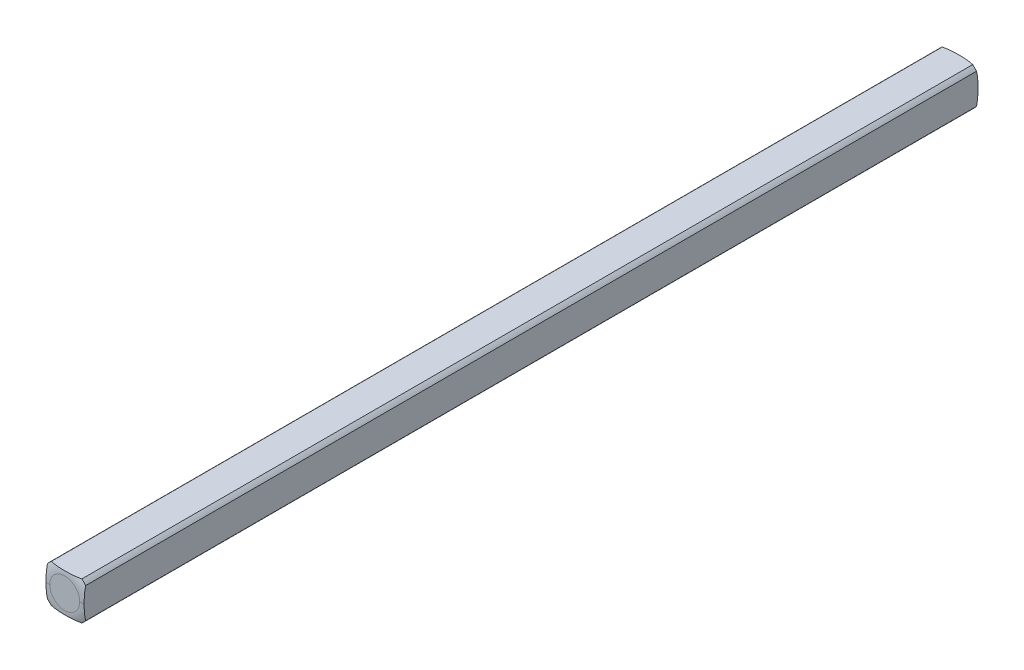
ISO-10303-21;
HEADER;
FILE_DESCRIPTION(('STEP AP214'),'2;1');
FILE_NAME('part.step','',(''),(''),'','','');
FILE_SCHEMA(('AUTOMOTIVE_DESIGN { 1 0 10303 214 1 1 1 1 }'));
ENDSEC;
DATA;
#1=APPLICATION_CONTEXT('core data for automotive mechanical design processes');
#2=APPLICATION_PROTOCOL_DEFINITION('international standard','automotive_design',2000,#1);
#3=PRODUCT_CONTEXT('',#1,'mechanical');
#4=PRODUCT('Part','Part','',(#3));
#5=PRODUCT_RELATED_PRODUCT_CATEGORY('part','',(#4));
#6=PRODUCT_DEFINITION_FORMATION('','',#4);
#7=PRODUCT_DEFINITION_CONTEXT('part definition',#1,'design');
#8=PRODUCT_DEFINITION('design','',#6,#7);
#9=PRODUCT_DEFINITION_SHAPE('','',#8);
#10=(LENGTH_UNIT() NAMED_UNIT(*) SI_UNIT(.MILLI.,.METRE.));
#11=(NAMED_UNIT(*) PLANE_ANGLE_UNIT() SI_UNIT($,.RADIAN.));
#12=(NAMED_UNIT(*) SI_UNIT($,.STERADIAN.) SOLID_ANGLE_UNIT());
#13=UNCERTAINTY_MEASURE_WITH_UNIT(LENGTH_MEASURE(1.E-05),#10,'distance_accuracy_value','');
#14=(GEOMETRIC_REPRESENTATION_CONTEXT(3) GLOBAL_UNCERTAINTY_ASSIGNED_CONTEXT((#13)) GLOBAL_UNIT_ASSIGNED_CONTEXT((#10,
#11,#12)) REPRESENTATION_CONTEXT('',''));
#15=CARTESIAN_POINT('',(0.,0.,0.));
#16=DIRECTION('',(0.,0.,1.));
#17=DIRECTION('',(1.,0.,0.));
#18=AXIS2_PLACEMENT_3D('',#15,#16,#17);
#19=CARTESIAN_POINT('',(0.,0.,-37.211));
#20=DIRECTION('',(0.,0.,1.));
#21=DIRECTION('',(1.,0.,0.));
#22=AXIS2_PLACEMENT_3D('',#19,#20,#21);
#23=CYLINDRICAL_SURFACE('',#22,2.032);
#24=CARTESIAN_POINT('',(0.,0.,-37.059919142098));
#25=DIRECTION('',(0.,0.,1.));
#26=DIRECTION('',(1.,0.,0.));
#27=AXIS2_PLACEMENT_3D('',#24,#25,#26);
#28=CIRCLE('',#27,2.032);
#29=CARTESIAN_POINT('',(-1.26841150657032,1.5875,-37.059919142098));
#30=VERTEX_POINT('',#29);
#31=CARTESIAN_POINT('',(-1.5875,1.26841150657032,-37.059919142098));
#32=VERTEX_POINT('',#31);
#33=EDGE_CURVE('E394',#30,#32,#28,.T.);
#34=ORIENTED_EDGE('',*,*,#33,.T.);
#35=DIRECTION('',(0.,0.,1.));
#36=VECTOR('',#35,1.);
#37=CARTESIAN_POINT('',(-1.5875,1.26841150657032,-37.211));
#38=LINE('',#37,#36);
#39=CARTESIAN_POINT('',(-1.5875,1.26841150657032,37.059919142098));
#40=VERTEX_POINT('',#39);
#41=EDGE_CURVE('E255',#32,#40,#38,.T.);
#42=ORIENTED_EDGE('',*,*,#41,.T.);
#43=CARTESIAN_POINT('',(0.,0.,37.059919142098));
#44=DIRECTION('',(0.,0.,-1.));
#45=DIRECTION('',(-1.,0.,0.));
#46=AXIS2_PLACEMENT_3D('',#43,#44,#45);
#47=CIRCLE('',#46,2.032);
#48=CARTESIAN_POINT('',(-1.26841150657032,1.5875,37.059919142098));
#49=VERTEX_POINT('',#48);
#50=EDGE_CURVE('E9',#40,#49,#47,.T.);
#51=ORIENTED_EDGE('',*,*,#50,.T.);
#52=DIRECTION('',(0.,0.,-1.));
#53=VECTOR('',#52,1.);
#54=CARTESIAN_POINT('',(-1.26841150657032,1.5875,-37.211));
#55=LINE('',#54,#53);
#56=EDGE_CURVE('E501',#49,#30,#55,.T.);
#57=ORIENTED_EDGE('',*,*,#56,.T.);
#58=EDGE_LOOP('',(#34,#42,#51,#57));
#59=FACE_BOUND('',#58,.T.);
#60=ADVANCED_FACE('F15',(#59),#23,.T.);
#61=CARTESIAN_POINT('',(0.,0.,-37.211));
#62=DIRECTION('',(0.,0.,1.));
#63=DIRECTION('',(1.,0.,0.));
#64=AXIS2_PLACEMENT_3D('',#61,#62,#63);
#65=CYLINDRICAL_SURFACE('',#64,2.032);
#66=CARTESIAN_POINT('',(0.,0.,-37.059919142098));
#67=DIRECTION('',(0.,0.,1.));
#68=DIRECTION('',(1.,0.,0.));
#69=AXIS2_PLACEMENT_3D('',#66,#67,#68);
#70=CIRCLE('',#69,2.032);
#71=CARTESIAN_POINT('',(1.5875,1.26841150657032,-37.059919142098));
#72=VERTEX_POINT('',#71);
#73=CARTESIAN_POINT('',(1.26841150657032,1.5875,-37.059919142098));
#74=VERTEX_POINT('',#73);
#75=EDGE_CURVE('E164',#72,#74,#70,.T.);
#76=ORIENTED_EDGE('',*,*,#75,.T.);
#77=DIRECTION('',(0.,0.,1.));
#78=VECTOR('',#77,1.);
#79=CARTESIAN_POINT('',(1.26841150657032,1.5875,-37.211));
#80=LINE('',#79,#78);
#81=CARTESIAN_POINT('',(1.26841150657032,1.5875,37.059919142098));
#82=VERTEX_POINT('',#81);
#83=EDGE_CURVE('E66',#74,#82,#80,.T.);
#84=ORIENTED_EDGE('',*,*,#83,.T.);
#85=CARTESIAN_POINT('',(0.,0.,37.059919142098));
#86=DIRECTION('',(0.,0.,-1.));
#87=DIRECTION('',(-1.,0.,0.));
#88=AXIS2_PLACEMENT_3D('',#85,#86,#87);
#89=CIRCLE('',#88,2.032);
#90=CARTESIAN_POINT('',(1.5875,1.26841150657032,37.059919142098));
#91=VERTEX_POINT('',#90);
#92=EDGE_CURVE('E29',#82,#91,#89,.T.);
#93=ORIENTED_EDGE('',*,*,#92,.T.);
#94=DIRECTION('',(0.,0.,-1.));
#95=VECTOR('',#94,1.);
#96=CARTESIAN_POINT('',(1.5875,1.26841150657032,-37.211));
#97=LINE('',#96,#95);
#98=EDGE_CURVE('E67',#91,#72,#97,.T.);
#99=ORIENTED_EDGE('',*,*,#98,.T.);
#100=EDGE_LOOP('',(#76,#84,#93,#99));
#101=FACE_BOUND('',#100,.T.);
#102=ADVANCED_FACE('F17',(#101),#65,.T.);
#103=CARTESIAN_POINT('',(0.,0.,-37.211));
#104=DIRECTION('',(0.,0.,1.));
#105=DIRECTION('',(1.,0.,0.));
#106=AXIS2_PLACEMENT_3D('',#103,#104,#105);
#107=CYLINDRICAL_SURFACE('',#106,2.032);
#108=CARTESIAN_POINT('',(0.,0.,-37.059919142098));
#109=DIRECTION('',(0.,0.,1.));
#110=DIRECTION('',(1.,0.,0.));
#111=AXIS2_PLACEMENT_3D('',#108,#109,#110);
#112=CIRCLE('',#111,2.032);
#113=CARTESIAN_POINT('',(1.26841150657032,-1.5875,-37.059919142098));
#114=VERTEX_POINT('',#113);
#115=CARTESIAN_POINT('',(1.5875,-1.26841150657032,-37.059919142098));
#116=VERTEX_POINT('',#115);
#117=EDGE_CURVE('E441',#114,#116,#112,.T.);
#118=ORIENTED_EDGE('',*,*,#117,.T.);
#119=DIRECTION('',(0.,0.,1.));
#120=VECTOR('',#119,1.);
#121=CARTESIAN_POINT('',(1.5875,-1.26841150657032,-37.211));
#122=LINE('',#121,#120);
#123=CARTESIAN_POINT('',(1.5875,-1.26841150657032,37.059919142098));
#124=VERTEX_POINT('',#123);
#125=EDGE_CURVE('E106',#116,#124,#122,.T.);
#126=ORIENTED_EDGE('',*,*,#125,.T.);
#127=CARTESIAN_POINT('',(0.,0.,37.059919142098));
#128=DIRECTION('',(0.,0.,-1.));
#129=DIRECTION('',(-1.,0.,0.));
#130=AXIS2_PLACEMENT_3D('',#127,#128,#129);
#131=CIRCLE('',#130,2.032);
#132=CARTESIAN_POINT('',(1.26841150657032,-1.5875,37.059919142098));
#133=VERTEX_POINT('',#132);
#134=EDGE_CURVE('E324',#124,#133,#131,.T.);
#135=ORIENTED_EDGE('',*,*,#134,.T.);
#136=DIRECTION('',(0.,0.,-1.));
#137=VECTOR('',#136,1.);
#138=CARTESIAN_POINT('',(1.26841150657032,-1.5875,-37.211));
#139=LINE('',#138,#137);
#140=EDGE_CURVE('E476',#133,#114,#139,.T.);
#141=ORIENTED_EDGE('',*,*,#140,.T.);
#142=EDGE_LOOP('',(#118,#126,#135,#141));
#143=FACE_BOUND('',#142,.T.);
#144=ADVANCED_FACE('F228',(#143),#107,.T.);
#145=CARTESIAN_POINT('',(0.,0.,-37.211));
#146=DIRECTION('',(0.,0.,1.));
#147=DIRECTION('',(1.,0.,0.));
#148=AXIS2_PLACEMENT_3D('',#145,#146,#147);
#149=CYLINDRICAL_SURFACE('',#148,2.032);
#150=CARTESIAN_POINT('',(0.,0.,-37.059919142098));
#151=DIRECTION('',(0.,0.,1.));
#152=DIRECTION('',(1.,0.,0.));
#153=AXIS2_PLACEMENT_3D('',#150,#151,#152);
#154=CIRCLE('',#153,2.032);
#155=CARTESIAN_POINT('',(-1.5875,-1.26841150657032,-37.059919142098));
#156=VERTEX_POINT('',#155);
#157=CARTESIAN_POINT('',(-1.26841150657032,-1.5875,-37.059919142098));
#158=VERTEX_POINT('',#157);
#159=EDGE_CURVE('E443',#156,#158,#154,.T.);
#160=ORIENTED_EDGE('',*,*,#159,.T.);
#161=DIRECTION('',(0.,0.,1.));
#162=VECTOR('',#161,1.);
#163=CARTESIAN_POINT('',(-1.26841150657032,-1.5875,-37.211));
#164=LINE('',#163,#162);
#165=CARTESIAN_POINT('',(-1.26841150657032,-1.5875,37.059919142098));
#166=VERTEX_POINT('',#165);
#167=EDGE_CURVE('E463',#158,#166,#164,.T.);
#168=ORIENTED_EDGE('',*,*,#167,.T.);
#169=CARTESIAN_POINT('',(0.,0.,37.059919142098));
#170=DIRECTION('',(0.,0.,-1.));
#171=DIRECTION('',(-1.,0.,0.));
#172=AXIS2_PLACEMENT_3D('',#169,#170,#171);
#173=CIRCLE('',#172,2.032);
#174=CARTESIAN_POINT('',(-1.5875,-1.26841150657032,37.059919142098));
#175=VERTEX_POINT('',#174);
#176=EDGE_CURVE('E359',#166,#175,#173,.T.);
#177=ORIENTED_EDGE('',*,*,#176,.T.);
#178=DIRECTION('',(0.,0.,-1.));
#179=VECTOR('',#178,1.);
#180=CARTESIAN_POINT('',(-1.5875,-1.26841150657032,-37.211));
#181=LINE('',#180,#179);
#182=EDGE_CURVE('E453',#175,#156,#181,.T.);
#183=ORIENTED_EDGE('',*,*,#182,.T.);
#184=EDGE_LOOP('',(#160,#168,#177,#183));
#185=FACE_BOUND('',#184,.T.);
#186=ADVANCED_FACE('F564',(#185),#149,.T.);
#187=CARTESIAN_POINT('',(-1.5875,1.5875,37.211));
#188=DIRECTION('',(0.,0.,-1.));
#189=DIRECTION('',(0.,-1.,0.));
#190=AXIS2_PLACEMENT_3D('',#187,#188,#189);
#191=PLANE('',#190);
#192=CARTESIAN_POINT('',(0.,0.,37.211));
#193=DIRECTION('',(0.,0.,1.));
#194=DIRECTION('',(1.,0.,0.));
#195=AXIS2_PLACEMENT_3D('',#192,#193,#194);
#196=CIRCLE('',#195,1.24506403026729);
#197=CARTESIAN_POINT('',(1.24506403026729,0.,37.211));
#198=VERTEX_POINT('',#197);
#199=CARTESIAN_POINT('',(-1.24506403026729,0.,37.211));
#200=VERTEX_POINT('',#199);
#201=EDGE_CURVE('E73',#198,#200,#196,.T.);
#202=ORIENTED_EDGE('',*,*,#201,.T.);
#203=CARTESIAN_POINT('',(0.,0.,37.211));
#204=DIRECTION('',(0.,0.,1.));
#205=DIRECTION('',(1.,0.,0.));
#206=AXIS2_PLACEMENT_3D('',#203,#204,#205);
#207=CIRCLE('',#206,1.24506403026729);
#208=EDGE_CURVE('E249',#200,#198,#207,.T.);
#209=ORIENTED_EDGE('',*,*,#208,.T.);
#210=EDGE_LOOP('',(#202,#209));
#211=FACE_BOUND('',#210,.T.);
#212=ADVANCED_FACE('F199',(#211),#191,.F.);
#213=CARTESIAN_POINT('',(-1.5875,1.5875,-37.211));
#214=DIRECTION('',(0.,0.,-1.));
#215=DIRECTION('',(0.,-1.,0.));
#216=AXIS2_PLACEMENT_3D('',#213,#214,#215);
#217=PLANE('',#216);
#218=CARTESIAN_POINT('',(0.,0.,-37.211));
#219=DIRECTION('',(0.,0.,1.));
#220=DIRECTION('',(1.,0.,0.));
#221=AXIS2_PLACEMENT_3D('',#218,#219,#220);
#222=CIRCLE('',#221,1.24506403026729);
#223=CARTESIAN_POINT('',(1.24506403026729,0.,-37.211));
#224=VERTEX_POINT('',#223);
#225=CARTESIAN_POINT('',(-1.24506403026729,0.,-37.211));
#226=VERTEX_POINT('',#225);
#227=EDGE_CURVE('E114',#224,#226,#222,.T.);
#228=ORIENTED_EDGE('',*,*,#227,.F.);
#229=CARTESIAN_POINT('',(0.,0.,-37.211));
#230=DIRECTION('',(0.,0.,1.));
#231=DIRECTION('',(1.,0.,0.));
#232=AXIS2_PLACEMENT_3D('',#229,#230,#231);
#233=CIRCLE('',#232,1.24506403026729);
#234=EDGE_CURVE('E444',#226,#224,#233,.T.);
#235=ORIENTED_EDGE('',*,*,#234,.F.);
#236=EDGE_LOOP('',(#228,#235));
#237=FACE_BOUND('',#236,.T.);
#238=ADVANCED_FACE('F230',(#237),#217,.T.);
#239=CARTESIAN_POINT('',(0.,0.,35.086));
#240=DIRECTION('',(0.,0.,-1.));
#241=DIRECTION('',(1.,0.,0.));
#242=AXIS2_PLACEMENT_3D('',#239,#240,#241);
#243=DEGENERATE_TOROIDAL_SURFACE('',#242,1.24506403026729,2.125,.T.);
#244=CARTESIAN_POINT('',(-1.24506403026729,0.,35.086));
#245=DIRECTION('',(0.,-1.,0.));
#246=DIRECTION('',(1.,0.,0.));
#247=AXIS2_PLACEMENT_3D('',#244,#245,#246);
#248=CIRCLE('',#247,2.125);
#249=CARTESIAN_POINT('',(-1.5875,0.,37.1832273616929));
#250=VERTEX_POINT('',#249);
#251=EDGE_CURVE('E239',#200,#250,#248,.T.);
#252=ORIENTED_EDGE('',*,*,#251,.F.);
#253=ORIENTED_EDGE('',*,*,#201,.F.);
#254=CARTESIAN_POINT('',(1.24506403026729,0.,35.086));
#255=DIRECTION('',(0.,1.,0.));
#256=DIRECTION('',(0.,0.,1.));
#257=AXIS2_PLACEMENT_3D('',#254,#255,#256);
#258=CIRCLE('',#257,2.125);
#259=CARTESIAN_POINT('',(1.5875,0.,37.1832273616929));
#260=VERTEX_POINT('',#259);
#261=EDGE_CURVE('E83',#198,#260,#258,.T.);
#262=ORIENTED_EDGE('',*,*,#261,.T.);
#263=CARTESIAN_POINT('',(1.5875,1.26841150657033,37.059919142098));
#264=CARTESIAN_POINT('',(1.5875,0.987077094942035,37.1299306391276));
#265=CARTESIAN_POINT('',(1.5875,0.63953045901757,37.1591819538897));
#266=CARTESIAN_POINT('',(1.5875,0.353837297550455,37.1832273616929));
#267=CARTESIAN_POINT('',(1.5875,0.,37.1832273616929));
#268=B_SPLINE_CURVE_WITH_KNOTS('',2,(#263,#264,#265,#266,#267),.UNSPECIFIED.,.F.,.F.,(3,2,3),
(0.,0.5,1.),.UNSPECIFIED.);
#269=EDGE_CURVE('E80',#91,#260,#268,.T.);
#270=ORIENTED_EDGE('',*,*,#269,.F.);
#271=ORIENTED_EDGE('',*,*,#92,.F.);
#272=CARTESIAN_POINT('',(-1.26841150657032,1.5875,37.059919142098));
#273=CARTESIAN_POINT('',(-0.77033823222201,1.5875,37.1838672057768));
#274=CARTESIAN_POINT('',(0.00849337593367507,1.5875,37.1832236517903));
#275=CARTESIAN_POINT('',(0.775470990386835,1.5875,37.1825898928413));
#276=CARTESIAN_POINT('',(1.26841150657033,1.5875,37.059919142098));
#277=B_SPLINE_CURVE_WITH_KNOTS('',2,(#272,#273,#274,#275,#276),.UNSPECIFIED.,.F.,.F.,(3,2,3),
(0.,0.5,1.),.UNSPECIFIED.);
#278=EDGE_CURVE('E214',#49,#82,#277,.T.);
#279=ORIENTED_EDGE('',*,*,#278,.F.);
#280=ORIENTED_EDGE('',*,*,#50,.F.);
#281=CARTESIAN_POINT('',(-1.5875,0.,37.1832273616929));
#282=CARTESIAN_POINT('',(-1.5875,0.353179957392105,37.1832273616929));
#283=CARTESIAN_POINT('',(-1.5875,0.6395293222865,37.1591820494506));
#284=CARTESIAN_POINT('',(-1.5875,0.98666984323891,37.1300319857817));
#285=CARTESIAN_POINT('',(-1.5875,1.26841150657033,37.059919142098));
#286=B_SPLINE_CURVE_WITH_KNOTS('',2,(#281,#282,#283,#284,#285),.UNSPECIFIED.,.F.,.F.,(3,2,3),
(0.,0.5,1.),.UNSPECIFIED.);
#287=EDGE_CURVE('E460',#250,#40,#286,.T.);
#288=ORIENTED_EDGE('',*,*,#287,.F.);
#289=EDGE_LOOP('',(#252,#253,#262,#270,#271,#279,#280,#288));
#290=FACE_BOUND('',#289,.T.);
#291=ADVANCED_FACE('F78',(#290),#243,.T.);
#292=CARTESIAN_POINT('',(0.,0.,-35.086));
#293=DIRECTION('',(0.,0.,1.));
#294=DIRECTION('',(1.,0.,0.));
#295=AXIS2_PLACEMENT_3D('',#292,#293,#294);
#296=DEGENERATE_TOROIDAL_SURFACE('',#295,1.24506403026729,2.125,.T.);
#297=CARTESIAN_POINT('',(-1.24506403026729,0.,-35.086));
#298=DIRECTION('',(0.,1.,0.));
#299=DIRECTION('',(-1.,0.,0.));
#300=AXIS2_PLACEMENT_3D('',#297,#298,#299);
#301=CIRCLE('',#300,2.125);
#302=CARTESIAN_POINT('',(-1.5875,0.,-37.1832273616929));
#303=VERTEX_POINT('',#302);
#304=EDGE_CURVE('E422',#226,#303,#301,.T.);
#305=ORIENTED_EDGE('',*,*,#304,.F.);
#306=ORIENTED_EDGE('',*,*,#234,.T.);
#307=CARTESIAN_POINT('',(1.24506403026729,0.,-35.086));
#308=DIRECTION('',(0.,-1.,0.));
#309=DIRECTION('',(0.,0.,-1.));
#310=AXIS2_PLACEMENT_3D('',#307,#308,#309);
#311=CIRCLE('',#310,2.125);
#312=CARTESIAN_POINT('',(1.5875,0.,-37.1832273616929));
#313=VERTEX_POINT('',#312);
#314=EDGE_CURVE('E254',#224,#313,#311,.T.);
#315=ORIENTED_EDGE('',*,*,#314,.T.);
#316=CARTESIAN_POINT('',(1.5875,-1.26841150657032,-37.059919142098));
#317=CARTESIAN_POINT('',(1.5875,-0.987077094928496,-37.129930639131));
#318=CARTESIAN_POINT('',(1.5875,-0.639530459017572,-37.1591819538896));
#319=CARTESIAN_POINT('',(1.5875,-0.353837297528382,-37.1832273616929));
#320=CARTESIAN_POINT('',(1.5875,0.,-37.1832273616929));
#321=B_SPLINE_CURVE_WITH_KNOTS('',2,(#316,#317,#318,#319,#320),.UNSPECIFIED.,.F.,.F.,(3,2,3),
(0.,0.5,1.),.UNSPECIFIED.);
#322=EDGE_CURVE('E97',#116,#313,#321,.T.);
#323=ORIENTED_EDGE('',*,*,#322,.F.);
#324=ORIENTED_EDGE('',*,*,#117,.F.);
#325=CARTESIAN_POINT('',(-1.26841150657032,-1.5875,-37.059919142098));
#326=CARTESIAN_POINT('',(-0.77033823224322,-1.5875,-37.1838672057716));
#327=CARTESIAN_POINT('',(0.00849337593367507,-1.5875,-37.1832236517903));
#328=CARTESIAN_POINT('',(0.775470990365865,-1.5875,-37.1825898928465));
#329=CARTESIAN_POINT('',(1.26841150657033,-1.5875,-37.059919142098));
#330=B_SPLINE_CURVE_WITH_KNOTS('',2,(#325,#326,#327,#328,#329),.UNSPECIFIED.,.F.,.F.,(3,2,3),
(0.,0.5,1.),.UNSPECIFIED.);
#331=EDGE_CURVE('E468',#158,#114,#330,.T.);
#332=ORIENTED_EDGE('',*,*,#331,.F.);
#333=ORIENTED_EDGE('',*,*,#159,.F.);
#334=CARTESIAN_POINT('',(-1.5875,0.,-37.1832273616929));
#335=CARTESIAN_POINT('',(-1.5875,-0.353179957413704,-37.1832273616929));
#336=CARTESIAN_POINT('',(-1.5875,-0.639529322286498,-37.1591820494506));
#337=CARTESIAN_POINT('',(-1.5875,-0.986669843252431,-37.1300319857783));
#338=CARTESIAN_POINT('',(-1.5875,-1.26841150657032,-37.059919142098));
#339=B_SPLINE_CURVE_WITH_KNOTS('',2,(#334,#335,#336,#337,#338),.UNSPECIFIED.,.F.,.F.,(3,2,3),
(0.,0.5,1.),.UNSPECIFIED.);
#340=EDGE_CURVE('E252',#303,#156,#339,.T.);
#341=ORIENTED_EDGE('',*,*,#340,.F.);
#342=EDGE_LOOP('',(#305,#306,#315,#323,#324,#332,#333,#341));
#343=FACE_BOUND('',#342,.T.);
#344=ADVANCED_FACE('F200',(#343),#296,.T.);
#345=CARTESIAN_POINT('',(-1.5875,1.5875,37.211));
#346=DIRECTION('',(0.,-1.,0.));
#347=DIRECTION('',(0.,0.,-1.));
#348=AXIS2_PLACEMENT_3D('',#345,#346,#347);
#349=PLANE('',#348);
#350=ORIENTED_EDGE('',*,*,#83,.F.);
#351=CARTESIAN_POINT('',(1.26841150657033,1.5875,-37.059919142098));
#352=CARTESIAN_POINT('',(0.77033823224322,1.5875,-37.1838672057716));
#353=CARTESIAN_POINT('',(-0.00849337593367486,1.5875,-37.1832236517903));
#354=CARTESIAN_POINT('',(-0.775470990365863,1.5875,-37.1825898928465));
#355=CARTESIAN_POINT('',(-1.26841150657032,1.5875,-37.059919142098));
#356=B_SPLINE_CURVE_WITH_KNOTS('',2,(#351,#352,#353,#354,#355),.UNSPECIFIED.,.F.,.F.,(3,2,3),
(0.,0.5,1.),.UNSPECIFIED.);
#357=EDGE_CURVE('E172',#74,#30,#356,.T.);
#358=ORIENTED_EDGE('',*,*,#357,.T.);
#359=ORIENTED_EDGE('',*,*,#56,.F.);
#360=ORIENTED_EDGE('',*,*,#278,.T.);
#361=EDGE_LOOP('',(#350,#358,#359,#360));
#362=FACE_BOUND('',#361,.T.);
#363=ADVANCED_FACE('F140',(#362),#349,.F.);
#364=CARTESIAN_POINT('',(1.5875,-1.5875,37.211));
#365=DIRECTION('',(-1.,0.,0.));
#366=DIRECTION('',(0.,0.,1.));
#367=AXIS2_PLACEMENT_3D('',#364,#365,#366);
#368=PLANE('',#367);
#369=ORIENTED_EDGE('',*,*,#125,.F.);
#370=ORIENTED_EDGE('',*,*,#322,.T.);
#371=CARTESIAN_POINT('',(1.5875,0.,-37.1832273616929));
#372=CARTESIAN_POINT('',(1.5875,0.353179957413705,-37.1832273616929));
#373=CARTESIAN_POINT('',(1.5875,0.6395293222865,-37.1591820494506));
#374=CARTESIAN_POINT('',(1.5875,0.986669843252375,-37.1300319857783));
#375=CARTESIAN_POINT('',(1.5875,1.26841150657033,-37.059919142098));
#376=B_SPLINE_CURVE_WITH_KNOTS('',2,(#371,#372,#373,#374,#375),.UNSPECIFIED.,.F.,.F.,(3,2,3),
(0.,0.5,1.),.UNSPECIFIED.);
#377=EDGE_CURVE('E98',#313,#72,#376,.T.);
#378=ORIENTED_EDGE('',*,*,#377,.T.);
#379=ORIENTED_EDGE('',*,*,#98,.F.);
#380=ORIENTED_EDGE('',*,*,#269,.T.);
#381=CARTESIAN_POINT('',(1.5875,0.,37.1832273616929));
#382=CARTESIAN_POINT('',(1.5875,-0.353179957392074,37.1832273616929));
#383=CARTESIAN_POINT('',(1.5875,-0.639529322286498,37.1591820494506));
#384=CARTESIAN_POINT('',(1.5875,-0.986669843238833,37.1300319857817));
#385=CARTESIAN_POINT('',(1.5875,-1.26841150657032,37.059919142098));
#386=B_SPLINE_CURVE_WITH_KNOTS('',2,(#381,#382,#383,#384,#385),.UNSPECIFIED.,.F.,.F.,(3,2,3),
(0.,0.5,1.),.UNSPECIFIED.);
#387=EDGE_CURVE('E117',#260,#124,#386,.T.);
#388=ORIENTED_EDGE('',*,*,#387,.T.);
#389=EDGE_LOOP('',(#369,#370,#378,#379,#380,#388));
#390=FACE_BOUND('',#389,.T.);
#391=ADVANCED_FACE('F91',(#390),#368,.F.);
#392=CARTESIAN_POINT('',(-1.5875,-1.5875,37.211));
#393=DIRECTION('',(0.,1.,0.));
#394=DIRECTION('',(1.,0.,0.));
#395=AXIS2_PLACEMENT_3D('',#392,#393,#394);
#396=PLANE('',#395);
#397=ORIENTED_EDGE('',*,*,#167,.F.);
#398=ORIENTED_EDGE('',*,*,#331,.T.);
#399=ORIENTED_EDGE('',*,*,#140,.F.);
#400=CARTESIAN_POINT('',(1.26841150657033,-1.5875,37.059919142098));
#401=CARTESIAN_POINT('',(0.77033823222201,-1.5875,37.1838672057768));
#402=CARTESIAN_POINT('',(-0.00849337593367486,-1.5875,37.1832236517903));
#403=CARTESIAN_POINT('',(-0.775470990386834,-1.5875,37.1825898928413));
#404=CARTESIAN_POINT('',(-1.26841150657032,-1.5875,37.059919142098));
#405=B_SPLINE_CURVE_WITH_KNOTS('',2,(#400,#401,#402,#403,#404),.UNSPECIFIED.,.F.,.F.,(3,2,3),
(0.,0.5,1.),.UNSPECIFIED.);
#406=EDGE_CURVE('E335',#133,#166,#405,.T.);
#407=ORIENTED_EDGE('',*,*,#406,.T.);
#408=EDGE_LOOP('',(#397,#398,#399,#407));
#409=FACE_BOUND('',#408,.T.);
#410=ADVANCED_FACE('F137',(#409),#396,.F.);
#411=CARTESIAN_POINT('',(-1.5875,-1.5875,37.211));
#412=DIRECTION('',(1.,0.,0.));
#413=DIRECTION('',(0.,1.,0.));
#414=AXIS2_PLACEMENT_3D('',#411,#412,#413);
#415=PLANE('',#414);
#416=ORIENTED_EDGE('',*,*,#41,.F.);
#417=CARTESIAN_POINT('',(-1.5875,1.26841150657033,-37.059919142098));
#418=CARTESIAN_POINT('',(-1.5875,0.987077094928535,-37.129930639131));
#419=CARTESIAN_POINT('',(-1.5875,0.63953045901757,-37.1591819538896));
#420=CARTESIAN_POINT('',(-1.5875,0.35383729752844,-37.1832273616929));
#421=CARTESIAN_POINT('',(-1.5875,0.,-37.1832273616929));
#422=B_SPLINE_CURVE_WITH_KNOTS('',2,(#417,#418,#419,#420,#421),.UNSPECIFIED.,.F.,.F.,(3,2,3),
(0.,0.5,1.),.UNSPECIFIED.);
#423=EDGE_CURVE('E301',#32,#303,#422,.T.);
#424=ORIENTED_EDGE('',*,*,#423,.T.);
#425=ORIENTED_EDGE('',*,*,#340,.T.);
#426=ORIENTED_EDGE('',*,*,#182,.F.);
#427=CARTESIAN_POINT('',(-1.5875,-1.26841150657032,37.059919142098));
#428=CARTESIAN_POINT('',(-1.5875,-0.987077094941996,37.1299306391276));
#429=CARTESIAN_POINT('',(-1.5875,-0.639530459017572,37.1591819538897));
#430=CARTESIAN_POINT('',(-1.5875,-0.353837297550398,37.1832273616929));
#431=CARTESIAN_POINT('',(-1.5875,0.,37.1832273616929));
#432=B_SPLINE_CURVE_WITH_KNOTS('',2,(#427,#428,#429,#430,#431),.UNSPECIFIED.,.F.,.F.,(3,2,3),
(0.,0.5,1.),.UNSPECIFIED.);
#433=EDGE_CURVE('E250',#175,#250,#432,.T.);
#434=ORIENTED_EDGE('',*,*,#433,.T.);
#435=ORIENTED_EDGE('',*,*,#287,.T.);
#436=EDGE_LOOP('',(#416,#424,#425,#426,#434,#435));
#437=FACE_BOUND('',#436,.T.);
#438=ADVANCED_FACE('F266',(#437),#415,.F.);
#439=CARTESIAN_POINT('',(0.,0.,-35.086));
#440=DIRECTION('',(0.,0.,1.));
#441=DIRECTION('',(1.,0.,0.));
#442=AXIS2_PLACEMENT_3D('',#439,#440,#441);
#443=DEGENERATE_TOROIDAL_SURFACE('',#442,1.24506403026729,2.125,.T.);
#444=ORIENTED_EDGE('',*,*,#227,.T.);
#445=ORIENTED_EDGE('',*,*,#304,.T.);
#446=ORIENTED_EDGE('',*,*,#423,.F.);
#447=ORIENTED_EDGE('',*,*,#33,.F.);
#448=ORIENTED_EDGE('',*,*,#357,.F.);
#449=ORIENTED_EDGE('',*,*,#75,.F.);
#450=ORIENTED_EDGE('',*,*,#377,.F.);
#451=ORIENTED_EDGE('',*,*,#314,.F.);
#452=EDGE_LOOP('',(#444,#445,#446,#447,#448,#449,#450,#451));
#453=FACE_BOUND('',#452,.T.);
#454=ADVANCED_FACE('F138',(#453),#443,.T.);
#455=CARTESIAN_POINT('',(0.,0.,35.086));
#456=DIRECTION('',(0.,0.,-1.));
#457=DIRECTION('',(1.,0.,0.));
#458=AXIS2_PLACEMENT_3D('',#455,#456,#457);
#459=DEGENERATE_TOROIDAL_SURFACE('',#458,1.24506403026729,2.125,.T.);
#460=ORIENTED_EDGE('',*,*,#208,.F.);
#461=ORIENTED_EDGE('',*,*,#251,.T.);
#462=ORIENTED_EDGE('',*,*,#433,.F.);
#463=ORIENTED_EDGE('',*,*,#176,.F.);
#464=ORIENTED_EDGE('',*,*,#406,.F.);
#465=ORIENTED_EDGE('',*,*,#134,.F.);
#466=ORIENTED_EDGE('',*,*,#387,.F.);
#467=ORIENTED_EDGE('',*,*,#261,.F.);
#468=EDGE_LOOP('',(#460,#461,#462,#463,#464,#465,#466,#467));
#469=FACE_BOUND('',#468,.T.);
#470=ADVANCED_FACE('F139',(#469),#459,.T.);
#471=CLOSED_SHELL('',(#60,#102,#144,#186,#212,#238,#291,#344,#363,#391,#410,#438,#454,#470));
#472=MANIFOLD_SOLID_BREP('B1',#471);
#473=ADVANCED_BREP_SHAPE_REPRESENTATION('',(#18,#472),#14);
#474=SHAPE_DEFINITION_REPRESENTATION(#9,#473);
ENDSEC;
END-ISO-10303-21;
